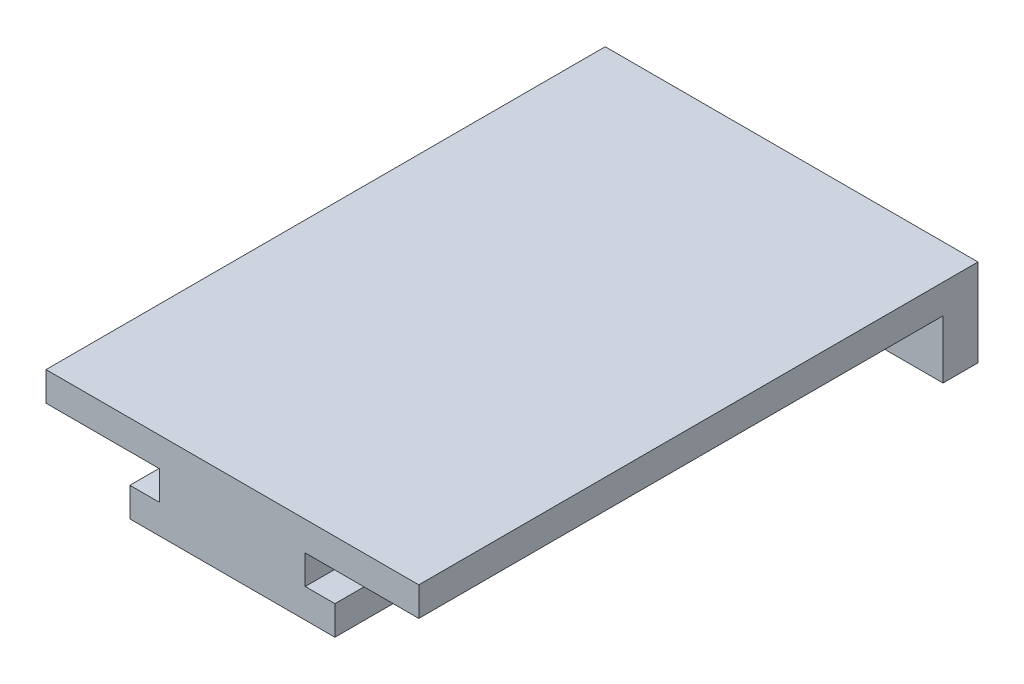
ISO-10303-21;
HEADER;
FILE_DESCRIPTION(('STEP AP214'),'2;1');
FILE_NAME('part.step','',(''),(''),'','','');
FILE_SCHEMA(('AUTOMOTIVE_DESIGN { 1 0 10303 214 1 1 1 1 }'));
ENDSEC;
DATA;
#1=APPLICATION_CONTEXT('core data for automotive mechanical design processes');
#2=APPLICATION_PROTOCOL_DEFINITION('international standard','automotive_design',2000,#1);
#3=PRODUCT_CONTEXT('',#1,'mechanical');
#4=PRODUCT('Part','Part','',(#3));
#5=PRODUCT_RELATED_PRODUCT_CATEGORY('part','',(#4));
#6=PRODUCT_DEFINITION_FORMATION('','',#4);
#7=PRODUCT_DEFINITION_CONTEXT('part definition',#1,'design');
#8=PRODUCT_DEFINITION('design','',#6,#7);
#9=PRODUCT_DEFINITION_SHAPE('','',#8);
#10=(LENGTH_UNIT() NAMED_UNIT(*) SI_UNIT(.MILLI.,.METRE.));
#11=(NAMED_UNIT(*) PLANE_ANGLE_UNIT() SI_UNIT($,.RADIAN.));
#12=(NAMED_UNIT(*) SI_UNIT($,.STERADIAN.) SOLID_ANGLE_UNIT());
#13=UNCERTAINTY_MEASURE_WITH_UNIT(LENGTH_MEASURE(1.E-05),#10,'distance_accuracy_value','');
#14=(GEOMETRIC_REPRESENTATION_CONTEXT(3) GLOBAL_UNCERTAINTY_ASSIGNED_CONTEXT((#13)) GLOBAL_UNIT_ASSIGNED_CONTEXT((#10,
#11,#12)) REPRESENTATION_CONTEXT('',''));
#15=CARTESIAN_POINT('',(0.,0.,0.));
#16=DIRECTION('',(0.,0.,1.));
#17=DIRECTION('',(1.,0.,0.));
#18=AXIS2_PLACEMENT_3D('',#15,#16,#17);
#19=CARTESIAN_POINT('',(0.,0.289855072463773,45.));
#20=DIRECTION('',(0.,1.,0.));
#21=DIRECTION('',(0.,0.,1.));
#22=AXIS2_PLACEMENT_3D('',#19,#20,#21);
#23=PLANE('',#22);
#24=DIRECTION('',(1.,0.,0.));
#25=VECTOR('',#24,1.);
#26=CARTESIAN_POINT('',(0.,0.289855072463773,0.));
#27=LINE('',#26,#25);
#28=CARTESIAN_POINT('',(3.04710144927535,0.289855072463773,0.));
#29=VERTEX_POINT('',#28);
#30=CARTESIAN_POINT('',(12.7971014492753,0.289855072463773,0.));
#31=VERTEX_POINT('',#30);
#32=EDGE_CURVE('E130',#29,#31,#27,.T.);
#33=ORIENTED_EDGE('',*,*,#32,.T.);
#34=DIRECTION('',(0.,0.,-1.));
#35=VECTOR('',#34,1.);
#36=CARTESIAN_POINT('',(12.7971014492753,0.289855072463773,45.));
#37=LINE('',#36,#35);
#38=CARTESIAN_POINT('',(12.7971014492753,0.289855072463773,45.));
#39=VERTEX_POINT('',#38);
#40=EDGE_CURVE('E11',#39,#31,#37,.T.);
#41=ORIENTED_EDGE('',*,*,#40,.F.);
#42=DIRECTION('',(1.,0.,0.));
#43=VECTOR('',#42,1.);
#44=CARTESIAN_POINT('',(0.,0.289855072463773,45.));
#45=LINE('',#44,#43);
#46=CARTESIAN_POINT('',(3.04710144927535,0.289855072463773,45.));
#47=VERTEX_POINT('',#46);
#48=EDGE_CURVE('E143',#47,#39,#45,.T.);
#49=ORIENTED_EDGE('',*,*,#48,.F.);
#50=DIRECTION('',(0.,0.,-1.));
#51=VECTOR('',#50,1.);
#52=CARTESIAN_POINT('',(3.04710144927535,0.289855072463773,45.));
#53=LINE('',#52,#51);
#54=EDGE_CURVE('E58',#47,#29,#53,.T.);
#55=ORIENTED_EDGE('',*,*,#54,.T.);
#56=EDGE_LOOP('',(#33,#41,#49,#55));
#57=FACE_BOUND('',#56,.T.);
#58=ADVANCED_FACE('F41',(#57),#23,.F.);
#59=CARTESIAN_POINT('',(12.7971014492753,0.,45.));
#60=DIRECTION('',(-1.,0.,0.));
#61=DIRECTION('',(0.,0.,1.));
#62=AXIS2_PLACEMENT_3D('',#59,#60,#61);
#63=PLANE('',#62);
#64=ORIENTED_EDGE('',*,*,#40,.T.);
#65=DIRECTION('',(0.,-1.,0.));
#66=VECTOR('',#65,1.);
#67=CARTESIAN_POINT('',(12.7971014492753,2.78985507246377,0.));
#68=LINE('',#67,#66);
#69=CARTESIAN_POINT('',(12.7971014492753,-4.71014492753623,0.));
#70=VERTEX_POINT('',#69);
#71=EDGE_CURVE('E195',#31,#70,#68,.T.);
#72=ORIENTED_EDGE('',*,*,#71,.T.);
#73=DIRECTION('',(0.,0.,1.));
#74=VECTOR('',#73,1.);
#75=CARTESIAN_POINT('',(12.7971014492753,-4.71014492753623,-3.));
#76=LINE('',#75,#74);
#77=CARTESIAN_POINT('',(12.7971014492753,-4.71014492753623,-3.));
#78=VERTEX_POINT('',#77);
#79=EDGE_CURVE('E181',#78,#70,#76,.T.);
#80=ORIENTED_EDGE('',*,*,#79,.F.);
#81=DIRECTION('',(0.,-1.,0.));
#82=VECTOR('',#81,1.);
#83=CARTESIAN_POINT('',(12.7971014492753,2.78985507246377,-3.));
#84=LINE('',#83,#82);
#85=CARTESIAN_POINT('',(12.7971014492753,2.78985507246377,-3.));
#86=VERTEX_POINT('',#85);
#87=EDGE_CURVE('E171',#86,#78,#84,.T.);
#88=ORIENTED_EDGE('',*,*,#87,.F.);
#89=DIRECTION('',(0.,0.,-1.));
#90=VECTOR('',#89,1.);
#91=CARTESIAN_POINT('',(12.7971014492753,2.78985507246377,45.));
#92=LINE('',#91,#90);
#93=CARTESIAN_POINT('',(12.7971014492753,2.78985507246377,45.));
#94=VERTEX_POINT('',#93);
#95=EDGE_CURVE('E50',#94,#86,#92,.T.);
#96=ORIENTED_EDGE('',*,*,#95,.F.);
#97=DIRECTION('',(0.,1.,0.));
#98=VECTOR('',#97,1.);
#99=CARTESIAN_POINT('',(12.7971014492753,0.,45.));
#100=LINE('',#99,#98);
#101=EDGE_CURVE('E86',#39,#94,#100,.T.);
#102=ORIENTED_EDGE('',*,*,#101,.F.);
#103=EDGE_LOOP('',(#64,#72,#80,#88,#96,#102));
#104=FACE_BOUND('',#103,.T.);
#105=ADVANCED_FACE('F178',(#104),#63,.F.);
#106=CARTESIAN_POINT('',(0.,2.78985507246377,45.));
#107=DIRECTION('',(0.,1.,0.));
#108=DIRECTION('',(0.,0.,1.));
#109=AXIS2_PLACEMENT_3D('',#106,#107,#108);
#110=PLANE('',#109);
#111=ORIENTED_EDGE('',*,*,#95,.T.);
#112=DIRECTION('',(1.,0.,0.));
#113=VECTOR('',#112,1.);
#114=CARTESIAN_POINT('',(12.7971014492753,2.78985507246377,-3.));
#115=LINE('',#114,#113);
#116=CARTESIAN_POINT('',(-19.2028985507247,2.78985507246377,-3.));
#117=VERTEX_POINT('',#116);
#118=EDGE_CURVE('E159',#117,#86,#115,.T.);
#119=ORIENTED_EDGE('',*,*,#118,.F.);
#120=DIRECTION('',(0.,0.,-1.));
#121=VECTOR('',#120,1.);
#122=CARTESIAN_POINT('',(-19.2028985507247,2.78985507246377,45.));
#123=LINE('',#122,#121);
#124=CARTESIAN_POINT('',(-19.2028985507247,2.78985507246377,45.));
#125=VERTEX_POINT('',#124);
#126=EDGE_CURVE('E254',#125,#117,#123,.T.);
#127=ORIENTED_EDGE('',*,*,#126,.F.);
#128=DIRECTION('',(1.,0.,0.));
#129=VECTOR('',#128,1.);
#130=CARTESIAN_POINT('',(0.,2.78985507246377,45.));
#131=LINE('',#130,#129);
#132=EDGE_CURVE('E161',#125,#94,#131,.T.);
#133=ORIENTED_EDGE('',*,*,#132,.T.);
#134=EDGE_LOOP('',(#111,#119,#127,#133));
#135=FACE_BOUND('',#134,.T.);
#136=ADVANCED_FACE('F156',(#135),#110,.T.);
#137=CARTESIAN_POINT('',(0.,-4.71014492753623,45.));
#138=DIRECTION('',(0.,1.,0.));
#139=DIRECTION('',(0.,0.,1.));
#140=AXIS2_PLACEMENT_3D('',#137,#138,#139);
#141=PLANE('',#140);
#142=CARTESIAN_POINT('',(-3.20289855072465,-4.71014492753623,32.5));
#143=DIRECTION('',(0.,-1.,0.));
#144=DIRECTION('',(0.,0.,-1.));
#145=AXIS2_PLACEMENT_3D('',#142,#143,#144);
#146=CIRCLE('',#145,1.5);
#147=CARTESIAN_POINT('',(-3.20289855072465,-4.71014492753623,31.));
#148=VERTEX_POINT('',#147);
#149=EDGE_CURVE('E208',#148,#148,#146,.T.);
#150=ORIENTED_EDGE('',*,*,#149,.F.);
#151=EDGE_LOOP('',(#150));
#152=FACE_BOUND('',#151,.T.);
#153=CARTESIAN_POINT('',(-3.20289855072465,-4.71014492753623,12.5));
#154=DIRECTION('',(0.,-1.,0.));
#155=DIRECTION('',(0.,0.,1.));
#156=AXIS2_PLACEMENT_3D('',#153,#154,#155);
#157=CIRCLE('',#156,1.5);
#158=CARTESIAN_POINT('',(-3.20289855072465,-4.71014492753623,14.));
#159=VERTEX_POINT('',#158);
#160=EDGE_CURVE('E207',#159,#159,#157,.T.);
#161=ORIENTED_EDGE('',*,*,#160,.F.);
#162=EDGE_LOOP('',(#161));
#163=FACE_BOUND('',#162,.T.);
#164=DIRECTION('',(0.,0.,-1.));
#165=VECTOR('',#164,1.);
#166=CARTESIAN_POINT('',(-12.0028985507247,-4.71014492753623,45.));
#167=LINE('',#166,#165);
#168=CARTESIAN_POINT('',(-12.0028985507247,-4.71014492753623,45.));
#169=VERTEX_POINT('',#168);
#170=CARTESIAN_POINT('',(-12.0028985507247,-4.71014492753623,0.));
#171=VERTEX_POINT('',#170);
#172=EDGE_CURVE('E258',#169,#171,#167,.T.);
#173=ORIENTED_EDGE('',*,*,#172,.T.);
#174=DIRECTION('',(-1.,0.,0.));
#175=VECTOR('',#174,1.);
#176=CARTESIAN_POINT('',(12.7971014492753,-4.71014492753623,0.));
#177=LINE('',#176,#175);
#178=CARTESIAN_POINT('',(-19.2028985507247,-4.71014492753623,0.));
#179=VERTEX_POINT('',#178);
#180=EDGE_CURVE('E198',#171,#179,#177,.T.);
#181=ORIENTED_EDGE('',*,*,#180,.T.);
#182=DIRECTION('',(0.,0.,1.));
#183=VECTOR('',#182,1.);
#184=CARTESIAN_POINT('',(-19.2028985507247,-4.71014492753623,-3.));
#185=LINE('',#184,#183);
#186=CARTESIAN_POINT('',(-19.2028985507247,-4.71014492753623,-3.));
#187=VERTEX_POINT('',#186);
#188=EDGE_CURVE('E176',#187,#179,#185,.T.);
#189=ORIENTED_EDGE('',*,*,#188,.F.);
#190=DIRECTION('',(-1.,0.,0.));
#191=VECTOR('',#190,1.);
#192=CARTESIAN_POINT('',(12.7971014492753,-4.71014492753623,-3.));
#193=LINE('',#192,#191);
#194=EDGE_CURVE('E183',#78,#187,#193,.T.);
#195=ORIENTED_EDGE('',*,*,#194,.F.);
#196=ORIENTED_EDGE('',*,*,#79,.T.);
#197=CARTESIAN_POINT('',(5.59710144927535,-4.71014492753623,0.));
#198=VERTEX_POINT('',#197);
#199=EDGE_CURVE('E190',#70,#198,#177,.T.);
#200=ORIENTED_EDGE('',*,*,#199,.T.);
#201=DIRECTION('',(0.,0.,-1.));
#202=VECTOR('',#201,1.);
#203=CARTESIAN_POINT('',(5.59710144927535,-4.71014492753623,45.));
#204=LINE('',#203,#202);
#205=CARTESIAN_POINT('',(5.59710144927535,-4.71014492753623,45.));
#206=VERTEX_POINT('',#205);
#207=EDGE_CURVE('E109',#206,#198,#204,.T.);
#208=ORIENTED_EDGE('',*,*,#207,.F.);
#209=DIRECTION('',(1.,0.,0.));
#210=VECTOR('',#209,1.);
#211=CARTESIAN_POINT('',(0.,-4.71014492753623,45.));
#212=LINE('',#211,#210);
#213=EDGE_CURVE('E118',#169,#206,#212,.T.);
#214=ORIENTED_EDGE('',*,*,#213,.F.);
#215=EDGE_LOOP('',(#173,#181,#189,#195,#196,#200,#208,#214));
#216=FACE_BOUND('',#215,.T.);
#217=ADVANCED_FACE('F292',(#152,#163,#216),#141,.F.);
#218=CARTESIAN_POINT('',(5.59710144927535,0.,45.));
#219=DIRECTION('',(1.,0.,0.));
#220=DIRECTION('',(0.,1.,0.));
#221=AXIS2_PLACEMENT_3D('',#218,#219,#220);
#222=PLANE('',#221);
#223=DIRECTION('',(0.,-1.,0.));
#224=VECTOR('',#223,1.);
#225=CARTESIAN_POINT('',(5.59710144927535,0.,0.));
#226=LINE('',#225,#224);
#227=CARTESIAN_POINT('',(5.59710144927535,-2.21014492753623,0.));
#228=VERTEX_POINT('',#227);
#229=EDGE_CURVE('E104',#228,#198,#226,.T.);
#230=ORIENTED_EDGE('',*,*,#229,.F.);
#231=DIRECTION('',(0.,0.,-1.));
#232=VECTOR('',#231,1.);
#233=CARTESIAN_POINT('',(5.59710144927535,-2.21014492753623,45.));
#234=LINE('',#233,#232);
#235=CARTESIAN_POINT('',(5.59710144927535,-2.21014492753623,45.));
#236=VERTEX_POINT('',#235);
#237=EDGE_CURVE('E99',#236,#228,#234,.T.);
#238=ORIENTED_EDGE('',*,*,#237,.F.);
#239=DIRECTION('',(0.,-1.,0.));
#240=VECTOR('',#239,1.);
#241=CARTESIAN_POINT('',(5.59710144927535,0.,45.));
#242=LINE('',#241,#240);
#243=EDGE_CURVE('E102',#236,#206,#242,.T.);
#244=ORIENTED_EDGE('',*,*,#243,.T.);
#245=ORIENTED_EDGE('',*,*,#207,.T.);
#246=EDGE_LOOP('',(#230,#238,#244,#245));
#247=FACE_BOUND('',#246,.T.);
#248=ADVANCED_FACE('F101',(#247),#222,.T.);
#249=CARTESIAN_POINT('',(0.,-2.21014492753623,45.));
#250=DIRECTION('',(0.,1.,0.));
#251=DIRECTION('',(0.,0.,1.));
#252=AXIS2_PLACEMENT_3D('',#249,#250,#251);
#253=PLANE('',#252);
#254=DIRECTION('',(1.,0.,0.));
#255=VECTOR('',#254,1.);
#256=CARTESIAN_POINT('',(0.,-2.21014492753623,0.));
#257=LINE('',#256,#255);
#258=CARTESIAN_POINT('',(3.04710144927535,-2.21014492753623,0.));
#259=VERTEX_POINT('',#258);
#260=EDGE_CURVE('E136',#259,#228,#257,.T.);
#261=ORIENTED_EDGE('',*,*,#260,.F.);
#262=DIRECTION('',(0.,0.,-1.));
#263=VECTOR('',#262,1.);
#264=CARTESIAN_POINT('',(3.04710144927535,-2.21014492753623,45.));
#265=LINE('',#264,#263);
#266=CARTESIAN_POINT('',(3.04710144927535,-2.21014492753623,45.));
#267=VERTEX_POINT('',#266);
#268=EDGE_CURVE('E75',#267,#259,#265,.T.);
#269=ORIENTED_EDGE('',*,*,#268,.F.);
#270=DIRECTION('',(1.,0.,0.));
#271=VECTOR('',#270,1.);
#272=CARTESIAN_POINT('',(0.,-2.21014492753623,45.));
#273=LINE('',#272,#271);
#274=EDGE_CURVE('E115',#267,#236,#273,.T.);
#275=ORIENTED_EDGE('',*,*,#274,.T.);
#276=ORIENTED_EDGE('',*,*,#237,.T.);
#277=EDGE_LOOP('',(#261,#269,#275,#276));
#278=FACE_BOUND('',#277,.T.);
#279=ADVANCED_FACE('F122',(#278),#253,.T.);
#280=CARTESIAN_POINT('',(3.04710144927535,0.,45.));
#281=DIRECTION('',(1.,0.,0.));
#282=DIRECTION('',(0.,0.,-1.));
#283=AXIS2_PLACEMENT_3D('',#280,#281,#282);
#284=PLANE('',#283);
#285=DIRECTION('',(0.,-1.,0.));
#286=VECTOR('',#285,1.);
#287=CARTESIAN_POINT('',(3.04710144927535,0.,0.));
#288=LINE('',#287,#286);
#289=EDGE_CURVE('E139',#29,#259,#288,.T.);
#290=ORIENTED_EDGE('',*,*,#289,.F.);
#291=ORIENTED_EDGE('',*,*,#54,.F.);
#292=DIRECTION('',(0.,-1.,0.));
#293=VECTOR('',#292,1.);
#294=CARTESIAN_POINT('',(3.04710144927535,0.,45.));
#295=LINE('',#294,#293);
#296=EDGE_CURVE('E124',#47,#267,#295,.T.);
#297=ORIENTED_EDGE('',*,*,#296,.T.);
#298=ORIENTED_EDGE('',*,*,#268,.T.);
#299=EDGE_LOOP('',(#290,#291,#297,#298));
#300=FACE_BOUND('',#299,.T.);
#301=ADVANCED_FACE('F374',(#300),#284,.T.);
#302=CARTESIAN_POINT('',(0.,0.,45.));
#303=DIRECTION('',(0.,0.,1.));
#304=DIRECTION('',(1.,0.,0.));
#305=AXIS2_PLACEMENT_3D('',#302,#303,#304);
#306=PLANE('',#305);
#307=ORIENTED_EDGE('',*,*,#48,.T.);
#308=ORIENTED_EDGE('',*,*,#101,.T.);
#309=ORIENTED_EDGE('',*,*,#132,.F.);
#310=DIRECTION('',(0.,1.,0.));
#311=VECTOR('',#310,1.);
#312=CARTESIAN_POINT('',(-19.2028985507247,0.,45.));
#313=LINE('',#312,#311);
#314=CARTESIAN_POINT('',(-19.2028985507247,0.289855072463773,45.));
#315=VERTEX_POINT('',#314);
#316=EDGE_CURVE('E232',#315,#125,#313,.T.);
#317=ORIENTED_EDGE('',*,*,#316,.F.);
#318=DIRECTION('',(-1.,0.,0.));
#319=VECTOR('',#318,1.);
#320=CARTESIAN_POINT('',(-6.4057971014493,0.289855072463773,45.));
#321=LINE('',#320,#319);
#322=CARTESIAN_POINT('',(-9.45289855072465,0.289855072463773,45.));
#323=VERTEX_POINT('',#322);
#324=EDGE_CURVE('E216',#323,#315,#321,.T.);
#325=ORIENTED_EDGE('',*,*,#324,.F.);
#326=DIRECTION('',(0.,-1.,0.));
#327=VECTOR('',#326,1.);
#328=CARTESIAN_POINT('',(-9.45289855072465,0.,45.));
#329=LINE('',#328,#327);
#330=CARTESIAN_POINT('',(-9.45289855072465,-2.21014492753623,45.));
#331=VERTEX_POINT('',#330);
#332=EDGE_CURVE('E220',#323,#331,#329,.T.);
#333=ORIENTED_EDGE('',*,*,#332,.T.);
#334=DIRECTION('',(-1.,0.,0.));
#335=VECTOR('',#334,1.);
#336=CARTESIAN_POINT('',(-6.4057971014493,-2.21014492753623,45.));
#337=LINE('',#336,#335);
#338=CARTESIAN_POINT('',(-12.0028985507247,-2.21014492753623,45.));
#339=VERTEX_POINT('',#338);
#340=EDGE_CURVE('E225',#331,#339,#337,.T.);
#341=ORIENTED_EDGE('',*,*,#340,.T.);
#342=DIRECTION('',(0.,-1.,0.));
#343=VECTOR('',#342,1.);
#344=CARTESIAN_POINT('',(-12.0028985507246,0.,45.));
#345=LINE('',#344,#343);
#346=EDGE_CURVE('E229',#339,#169,#345,.T.);
#347=ORIENTED_EDGE('',*,*,#346,.T.);
#348=ORIENTED_EDGE('',*,*,#213,.T.);
#349=ORIENTED_EDGE('',*,*,#243,.F.);
#350=ORIENTED_EDGE('',*,*,#274,.F.);
#351=ORIENTED_EDGE('',*,*,#296,.F.);
#352=EDGE_LOOP('',(#307,#308,#309,#317,#325,#333,#341,#347,#348,#349,#350,#351));
#353=FACE_BOUND('',#352,.T.);
#354=ADVANCED_FACE('F113',(#353),#306,.T.);
#355=CARTESIAN_POINT('',(-6.4057971014493,0.289855072463773,45.));
#356=DIRECTION('',(0.,-1.,0.));
#357=DIRECTION('',(0.,0.,-1.));
#358=AXIS2_PLACEMENT_3D('',#355,#356,#357);
#359=PLANE('',#358);
#360=DIRECTION('',(-1.,0.,0.));
#361=VECTOR('',#360,1.);
#362=CARTESIAN_POINT('',(-6.4057971014493,0.289855072463773,0.));
#363=LINE('',#362,#361);
#364=CARTESIAN_POINT('',(-9.45289855072465,0.289855072463773,0.));
#365=VERTEX_POINT('',#364);
#366=CARTESIAN_POINT('',(-19.2028985507247,0.289855072463773,0.));
#367=VERTEX_POINT('',#366);
#368=EDGE_CURVE('E212',#365,#367,#363,.T.);
#369=ORIENTED_EDGE('',*,*,#368,.F.);
#370=DIRECTION('',(0.,0.,-1.));
#371=VECTOR('',#370,1.);
#372=CARTESIAN_POINT('',(-9.45289855072465,0.289855072463773,45.));
#373=LINE('',#372,#371);
#374=EDGE_CURVE('E133',#323,#365,#373,.T.);
#375=ORIENTED_EDGE('',*,*,#374,.F.);
#376=ORIENTED_EDGE('',*,*,#324,.T.);
#377=DIRECTION('',(0.,0.,-1.));
#378=VECTOR('',#377,1.);
#379=CARTESIAN_POINT('',(-19.2028985507247,0.289855072463773,45.));
#380=LINE('',#379,#378);
#381=EDGE_CURVE('E236',#315,#367,#380,.T.);
#382=ORIENTED_EDGE('',*,*,#381,.T.);
#383=EDGE_LOOP('',(#369,#375,#376,#382));
#384=FACE_BOUND('',#383,.T.);
#385=ADVANCED_FACE('F345',(#384),#359,.T.);
#386=CARTESIAN_POINT('',(-9.45289855072465,0.,45.));
#387=DIRECTION('',(1.,0.,0.));
#388=DIRECTION('',(0.,0.,-1.));
#389=AXIS2_PLACEMENT_3D('',#386,#387,#388);
#390=PLANE('',#389);
#391=DIRECTION('',(0.,-1.,0.));
#392=VECTOR('',#391,1.);
#393=CARTESIAN_POINT('',(-9.45289855072465,0.,0.));
#394=LINE('',#393,#392);
#395=CARTESIAN_POINT('',(-9.45289855072465,-2.21014492753623,0.));
#396=VERTEX_POINT('',#395);
#397=EDGE_CURVE('E240',#365,#396,#394,.T.);
#398=ORIENTED_EDGE('',*,*,#397,.T.);
#399=DIRECTION('',(0.,0.,-1.));
#400=VECTOR('',#399,1.);
#401=CARTESIAN_POINT('',(-9.45289855072465,-2.21014492753623,45.));
#402=LINE('',#401,#400);
#403=EDGE_CURVE('E266',#331,#396,#402,.T.);
#404=ORIENTED_EDGE('',*,*,#403,.F.);
#405=ORIENTED_EDGE('',*,*,#332,.F.);
#406=ORIENTED_EDGE('',*,*,#374,.T.);
#407=EDGE_LOOP('',(#398,#404,#405,#406));
#408=FACE_BOUND('',#407,.T.);
#409=ADVANCED_FACE('F347',(#408),#390,.F.);
#410=CARTESIAN_POINT('',(-6.4057971014493,-2.21014492753623,45.));
#411=DIRECTION('',(0.,-1.,0.));
#412=DIRECTION('',(0.,0.,-1.));
#413=AXIS2_PLACEMENT_3D('',#410,#411,#412);
#414=PLANE('',#413);
#415=DIRECTION('',(-1.,0.,0.));
#416=VECTOR('',#415,1.);
#417=CARTESIAN_POINT('',(-6.4057971014493,-2.21014492753623,0.));
#418=LINE('',#417,#416);
#419=CARTESIAN_POINT('',(-12.0028985507247,-2.21014492753623,0.));
#420=VERTEX_POINT('',#419);
#421=EDGE_CURVE('E244',#396,#420,#418,.T.);
#422=ORIENTED_EDGE('',*,*,#421,.T.);
#423=DIRECTION('',(0.,0.,-1.));
#424=VECTOR('',#423,1.);
#425=CARTESIAN_POINT('',(-12.0028985507247,-2.21014492753623,45.));
#426=LINE('',#425,#424);
#427=EDGE_CURVE('E262',#339,#420,#426,.T.);
#428=ORIENTED_EDGE('',*,*,#427,.F.);
#429=ORIENTED_EDGE('',*,*,#340,.F.);
#430=ORIENTED_EDGE('',*,*,#403,.T.);
#431=EDGE_LOOP('',(#422,#428,#429,#430));
#432=FACE_BOUND('',#431,.T.);
#433=ADVANCED_FACE('F349',(#432),#414,.F.);
#434=CARTESIAN_POINT('',(-12.0028985507246,0.,45.));
#435=DIRECTION('',(1.,0.,0.));
#436=DIRECTION('',(0.,1.,0.));
#437=AXIS2_PLACEMENT_3D('',#434,#435,#436);
#438=PLANE('',#437);
#439=DIRECTION('',(0.,-1.,0.));
#440=VECTOR('',#439,1.);
#441=CARTESIAN_POINT('',(-12.0028985507246,0.,0.));
#442=LINE('',#441,#440);
#443=EDGE_CURVE('E221',#420,#171,#442,.T.);
#444=ORIENTED_EDGE('',*,*,#443,.T.);
#445=ORIENTED_EDGE('',*,*,#172,.F.);
#446=ORIENTED_EDGE('',*,*,#346,.F.);
#447=ORIENTED_EDGE('',*,*,#427,.T.);
#448=EDGE_LOOP('',(#444,#445,#446,#447));
#449=FACE_BOUND('',#448,.T.);
#450=ADVANCED_FACE('F332',(#449),#438,.F.);
#451=CARTESIAN_POINT('',(-19.2028985507247,0.,45.));
#452=DIRECTION('',(-1.,0.,0.));
#453=DIRECTION('',(0.,0.,1.));
#454=AXIS2_PLACEMENT_3D('',#451,#452,#453);
#455=PLANE('',#454);
#456=ORIENTED_EDGE('',*,*,#126,.T.);
#457=DIRECTION('',(0.,1.,0.));
#458=VECTOR('',#457,1.);
#459=CARTESIAN_POINT('',(-19.2028985507247,2.78985507246377,-3.));
#460=LINE('',#459,#458);
#461=EDGE_CURVE('E174',#187,#117,#460,.T.);
#462=ORIENTED_EDGE('',*,*,#461,.F.);
#463=ORIENTED_EDGE('',*,*,#188,.T.);
#464=DIRECTION('',(0.,1.,0.));
#465=VECTOR('',#464,1.);
#466=CARTESIAN_POINT('',(-19.2028985507247,2.78985507246377,0.));
#467=LINE('',#466,#465);
#468=EDGE_CURVE('E184',#179,#367,#467,.T.);
#469=ORIENTED_EDGE('',*,*,#468,.T.);
#470=ORIENTED_EDGE('',*,*,#381,.F.);
#471=ORIENTED_EDGE('',*,*,#316,.T.);
#472=EDGE_LOOP('',(#456,#462,#463,#469,#470,#471));
#473=FACE_BOUND('',#472,.T.);
#474=ADVANCED_FACE('F340',(#473),#455,.T.);
#475=CARTESIAN_POINT('',(-3.20289855072465,-4.71014492753623,12.5));
#476=DIRECTION('',(0.,-1.,0.));
#477=DIRECTION('',(0.,0.,1.));
#478=AXIS2_PLACEMENT_3D('',#475,#476,#477);
#479=CONICAL_SURFACE('',#478,1.5,0.78539816339745);
#480=CARTESIAN_POINT('',(-3.20289855072465,-3.21014492753623,12.5));
#481=VERTEX_POINT('',#480);
#482=VERTEX_LOOP('',#481);
#483=FACE_BOUND('',#482,.T.);
#484=ORIENTED_EDGE('',*,*,#160,.T.);
#485=EDGE_LOOP('',(#484));
#486=FACE_BOUND('',#485,.T.);
#487=ADVANCED_FACE('F410',(#483,#486),#479,.F.);
#488=CARTESIAN_POINT('',(-3.20289855072465,-4.71014492753623,32.5));
#489=DIRECTION('',(0.,-1.,0.));
#490=DIRECTION('',(0.,0.,-1.));
#491=AXIS2_PLACEMENT_3D('',#488,#489,#490);
#492=CONICAL_SURFACE('',#491,1.5,0.78539816339745);
#493=CARTESIAN_POINT('',(-3.20289855072465,-3.21014492753623,32.5));
#494=VERTEX_POINT('',#493);
#495=VERTEX_LOOP('',#494);
#496=FACE_BOUND('',#495,.T.);
#497=ORIENTED_EDGE('',*,*,#149,.T.);
#498=EDGE_LOOP('',(#497));
#499=FACE_BOUND('',#498,.T.);
#500=ADVANCED_FACE('F421',(#496,#499),#492,.F.);
#501=CARTESIAN_POINT('',(0.,0.,0.));
#502=DIRECTION('',(0.,0.,-1.));
#503=DIRECTION('',(-1.,0.,0.));
#504=AXIS2_PLACEMENT_3D('',#501,#502,#503);
#505=PLANE('',#504);
#506=ORIENTED_EDGE('',*,*,#32,.F.);
#507=ORIENTED_EDGE('',*,*,#289,.T.);
#508=ORIENTED_EDGE('',*,*,#260,.T.);
#509=ORIENTED_EDGE('',*,*,#229,.T.);
#510=ORIENTED_EDGE('',*,*,#199,.F.);
#511=ORIENTED_EDGE('',*,*,#71,.F.);
#512=EDGE_LOOP('',(#506,#507,#508,#509,#510,#511));
#513=FACE_BOUND('',#512,.T.);
#514=ADVANCED_FACE('F289',(#513),#505,.F.);
#515=CARTESIAN_POINT('',(0.,0.,-3.));
#516=DIRECTION('',(0.,0.,-1.));
#517=DIRECTION('',(-1.,0.,0.));
#518=AXIS2_PLACEMENT_3D('',#515,#516,#517);
#519=PLANE('',#518);
#520=ORIENTED_EDGE('',*,*,#87,.T.);
#521=ORIENTED_EDGE('',*,*,#194,.T.);
#522=ORIENTED_EDGE('',*,*,#461,.T.);
#523=ORIENTED_EDGE('',*,*,#118,.T.);
#524=EDGE_LOOP('',(#520,#521,#522,#523));
#525=FACE_BOUND('',#524,.T.);
#526=ADVANCED_FACE('F168',(#525),#519,.T.);
#527=ORIENTED_EDGE('',*,*,#443,.F.);
#528=ORIENTED_EDGE('',*,*,#421,.F.);
#529=ORIENTED_EDGE('',*,*,#397,.F.);
#530=ORIENTED_EDGE('',*,*,#368,.T.);
#531=ORIENTED_EDGE('',*,*,#468,.F.);
#532=ORIENTED_EDGE('',*,*,#180,.F.);
#533=EDGE_LOOP('',(#527,#528,#529,#530,#531,#532));
#534=FACE_BOUND('',#533,.T.);
#535=ADVANCED_FACE('F335',(#534),#505,.F.);
#536=CLOSED_SHELL('',(#58,#105,#136,#217,#248,#279,#301,#354,#385,#409,#433,#450,#474,#487,#500,
#514,#526,#535));
#537=MANIFOLD_SOLID_BREP('B2',#536);
#538=ADVANCED_BREP_SHAPE_REPRESENTATION('',(#18,#537),#14);
#539=SHAPE_DEFINITION_REPRESENTATION(#9,#538);
ENDSEC;
END-ISO-10303-21;
